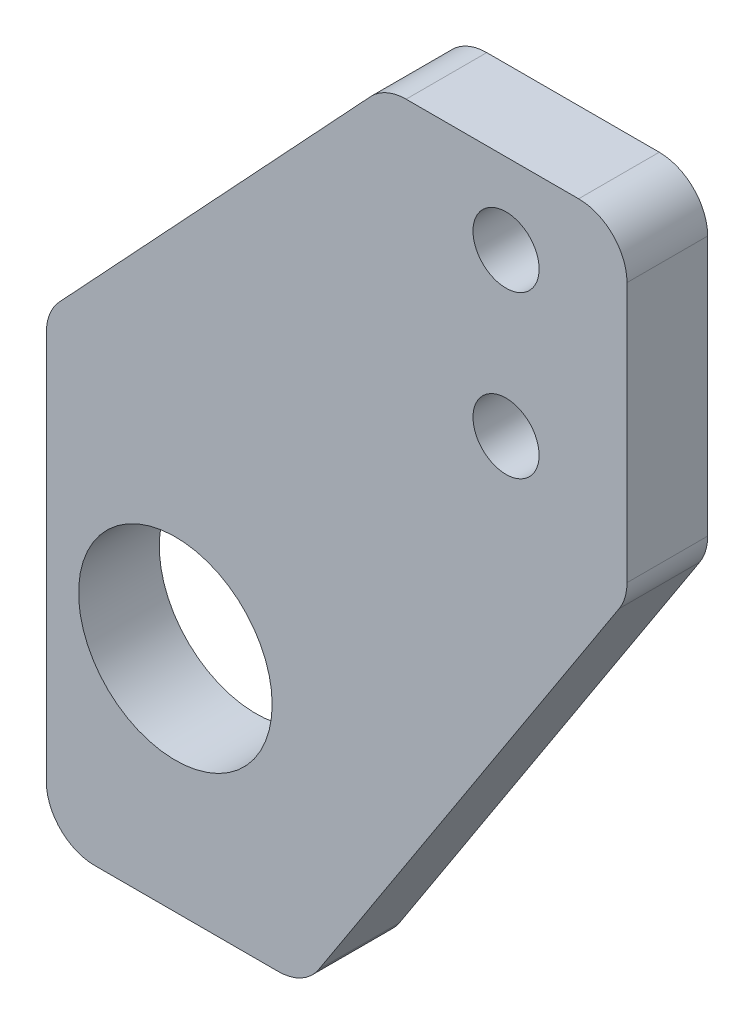
ISO-10303-21;
HEADER;
FILE_DESCRIPTION(('STEP AP214'),'2;1');
FILE_NAME('part.step','',(''),(''),'','','');
FILE_SCHEMA(('AUTOMOTIVE_DESIGN { 1 0 10303 214 1 1 1 1 }'));
ENDSEC;
DATA;
#1=APPLICATION_CONTEXT('core data for automotive mechanical design processes');
#2=APPLICATION_PROTOCOL_DEFINITION('international standard','automotive_design',2000,#1);
#3=PRODUCT_CONTEXT('',#1,'mechanical');
#4=PRODUCT('Part','Part','',(#3));
#5=PRODUCT_RELATED_PRODUCT_CATEGORY('part','',(#4));
#6=PRODUCT_DEFINITION_FORMATION('','',#4);
#7=PRODUCT_DEFINITION_CONTEXT('part definition',#1,'design');
#8=PRODUCT_DEFINITION('design','',#6,#7);
#9=PRODUCT_DEFINITION_SHAPE('','',#8);
#10=(LENGTH_UNIT() NAMED_UNIT(*) SI_UNIT(.MILLI.,.METRE.));
#11=(NAMED_UNIT(*) PLANE_ANGLE_UNIT() SI_UNIT($,.RADIAN.));
#12=(NAMED_UNIT(*) SI_UNIT($,.STERADIAN.) SOLID_ANGLE_UNIT());
#13=UNCERTAINTY_MEASURE_WITH_UNIT(LENGTH_MEASURE(1.E-05),#10,'distance_accuracy_value','');
#14=(GEOMETRIC_REPRESENTATION_CONTEXT(3) GLOBAL_UNCERTAINTY_ASSIGNED_CONTEXT((#13)) GLOBAL_UNIT_ASSIGNED_CONTEXT((#10,
#11,#12)) REPRESENTATION_CONTEXT('',''));
#15=CARTESIAN_POINT('',(0.,0.,0.));
#16=DIRECTION('',(0.,0.,1.));
#17=DIRECTION('',(1.,0.,0.));
#18=AXIS2_PLACEMENT_3D('',#15,#16,#17);
#19=CARTESIAN_POINT('',(-33.3562945368171,31.132541567696,5.));
#20=DIRECTION('',(-0.731055268242869,0.682318250360011,0.));
#21=DIRECTION('',(-0.682318250360011,-0.731055268242869,0.));
#22=AXIS2_PLACEMENT_3D('',#19,#20,#21);
#23=PLANE('',#22);
#24=DIRECTION('',(0.682318250360011,0.731055268242869,0.));
#25=VECTOR('',#24,1.);
#26=CARTESIAN_POINT('',(-33.3562945368171,31.132541567696,0.));
#27=LINE('',#26,#25);
#28=CARTESIAN_POINT('',(-35.1931658047286,29.1644652092193,0.));
#29=VERTEX_POINT('',#28);
#30=CARTESIAN_POINT('',(-15.889508898992,49.84695475108,0.));
#31=VERTEX_POINT('',#30);
#32=EDGE_CURVE('E219',#29,#31,#27,.T.);
#33=ORIENTED_EDGE('',*,*,#32,.F.);
#34=DIRECTION('',(0.,0.,-1.));
#35=VECTOR('',#34,1.);
#36=CARTESIAN_POINT('',(-35.1931658047286,29.1644652092193,5.));
#37=LINE('',#36,#35);
#38=CARTESIAN_POINT('',(-35.1931658047286,29.1644652092193,5.));
#39=VERTEX_POINT('',#38);
#40=EDGE_CURVE('E191',#29,#39,#37,.F.);
#41=ORIENTED_EDGE('',*,*,#40,.T.);
#42=DIRECTION('',(0.682318250360011,0.731055268242869,0.));
#43=VECTOR('',#42,1.);
#44=CARTESIAN_POINT('',(-33.3562945368171,31.132541567696,5.));
#45=LINE('',#44,#43);
#46=CARTESIAN_POINT('',(-15.889508898992,49.84695475108,5.));
#47=VERTEX_POINT('',#46);
#48=EDGE_CURVE('E237',#39,#47,#45,.T.);
#49=ORIENTED_EDGE('',*,*,#48,.T.);
#50=DIRECTION('',(0.,0.,-1.));
#51=VECTOR('',#50,1.);
#52=CARTESIAN_POINT('',(-15.889508898992,49.84695475108,0.));
#53=LINE('',#52,#51);
#54=EDGE_CURVE('E188',#47,#31,#53,.T.);
#55=ORIENTED_EDGE('',*,*,#54,.T.);
#56=EDGE_LOOP('',(#33,#41,#49,#55));
#57=FACE_BOUND('',#56,.T.);
#58=ADVANCED_FACE('F35',(#57),#23,.T.);
#59=CARTESIAN_POINT('',(-36.,0.,5.));
#60=DIRECTION('',(-1.,0.,0.));
#61=DIRECTION('',(0.,0.,1.));
#62=AXIS2_PLACEMENT_3D('',#59,#60,#61);
#63=PLANE('',#62);
#64=DIRECTION('',(0.,1.,0.));
#65=VECTOR('',#64,1.);
#66=CARTESIAN_POINT('',(-36.,0.,0.));
#67=LINE('',#66,#65);
#68=CARTESIAN_POINT('',(-36.,3.,0.));
#69=VERTEX_POINT('',#68);
#70=CARTESIAN_POINT('',(-36.,27.1175104581393,0.));
#71=VERTEX_POINT('',#70);
#72=EDGE_CURVE('E216',#69,#71,#67,.T.);
#73=ORIENTED_EDGE('',*,*,#72,.F.);
#74=DIRECTION('',(0.,0.,-1.));
#75=VECTOR('',#74,1.);
#76=CARTESIAN_POINT('',(-36.,3.,5.));
#77=LINE('',#76,#75);
#78=CARTESIAN_POINT('',(-36.,3.,5.));
#79=VERTEX_POINT('',#78);
#80=EDGE_CURVE('E186',#69,#79,#77,.F.);
#81=ORIENTED_EDGE('',*,*,#80,.T.);
#82=DIRECTION('',(0.,1.,0.));
#83=VECTOR('',#82,1.);
#84=CARTESIAN_POINT('',(-36.,0.,5.));
#85=LINE('',#84,#83);
#86=CARTESIAN_POINT('',(-36.,27.1175104581393,5.));
#87=VERTEX_POINT('',#86);
#88=EDGE_CURVE('E234',#79,#87,#85,.T.);
#89=ORIENTED_EDGE('',*,*,#88,.T.);
#90=DIRECTION('',(0.,0.,-1.));
#91=VECTOR('',#90,1.);
#92=CARTESIAN_POINT('',(-36.,27.1175104581393,5.));
#93=LINE('',#92,#91);
#94=EDGE_CURVE('E183',#87,#71,#93,.T.);
#95=ORIENTED_EDGE('',*,*,#94,.T.);
#96=EDGE_LOOP('',(#73,#81,#89,#95));
#97=FACE_BOUND('',#96,.T.);
#98=ADVANCED_FACE('F274',(#97),#63,.T.);
#99=CARTESIAN_POINT('',(0.,0.,5.));
#100=DIRECTION('',(0.,-1.,0.));
#101=DIRECTION('',(1.,0.,0.));
#102=AXIS2_PLACEMENT_3D('',#99,#100,#101);
#103=PLANE('',#102);
#104=DIRECTION('',(-1.,0.,0.));
#105=VECTOR('',#104,1.);
#106=CARTESIAN_POINT('',(0.,0.,0.));
#107=LINE('',#106,#105);
#108=CARTESIAN_POINT('',(-21.6289448917997,0.,0.));
#109=VERTEX_POINT('',#108);
#110=CARTESIAN_POINT('',(-33.,0.,0.));
#111=VERTEX_POINT('',#110);
#112=EDGE_CURVE('E146',#109,#111,#107,.T.);
#113=ORIENTED_EDGE('',*,*,#112,.F.);
#114=DIRECTION('',(0.,0.,-1.));
#115=VECTOR('',#114,1.);
#116=CARTESIAN_POINT('',(-21.6289448917997,0.,5.));
#117=LINE('',#116,#115);
#118=CARTESIAN_POINT('',(-21.6289448917997,0.,5.));
#119=VERTEX_POINT('',#118);
#120=EDGE_CURVE('E171',#109,#119,#117,.F.);
#121=ORIENTED_EDGE('',*,*,#120,.T.);
#122=DIRECTION('',(-1.,0.,0.));
#123=VECTOR('',#122,1.);
#124=CARTESIAN_POINT('',(0.,0.,5.));
#125=LINE('',#124,#123);
#126=CARTESIAN_POINT('',(-33.,0.,5.));
#127=VERTEX_POINT('',#126);
#128=EDGE_CURVE('E231',#119,#127,#125,.T.);
#129=ORIENTED_EDGE('',*,*,#128,.T.);
#130=DIRECTION('',(0.,0.,-1.));
#131=VECTOR('',#130,1.);
#132=CARTESIAN_POINT('',(-33.,0.,5.));
#133=LINE('',#132,#131);
#134=EDGE_CURVE('E168',#127,#111,#133,.T.);
#135=ORIENTED_EDGE('',*,*,#134,.T.);
#136=EDGE_LOOP('',(#113,#121,#129,#135));
#137=FACE_BOUND('',#136,.T.);
#138=ADVANCED_FACE('F280',(#137),#103,.T.);
#139=CARTESIAN_POINT('',(-14.0680982322933,9.13512872226836,5.));
#140=DIRECTION('',(0.838692381993937,-0.544605442853206,0.));
#141=DIRECTION('',(0.544605442853206,0.838692381993937,0.));
#142=AXIS2_PLACEMENT_3D('',#139,#140,#141);
#143=PLANE('',#142);
#144=DIRECTION('',(-0.544605442853206,-0.838692381993937,0.));
#145=VECTOR('',#144,1.);
#146=CARTESIAN_POINT('',(-14.0680982322933,9.13512872226836,5.));
#147=LINE('',#146,#145);
#148=CARTESIAN_POINT('',(-0.483922854018187,30.054758804812,5.));
#149=VERTEX_POINT('',#148);
#150=CARTESIAN_POINT('',(-19.1128677458179,1.36618367144038,5.));
#151=VERTEX_POINT('',#150);
#152=EDGE_CURVE('E203',#149,#151,#147,.T.);
#153=ORIENTED_EDGE('',*,*,#152,.T.);
#154=DIRECTION('',(0.,0.,-1.));
#155=VECTOR('',#154,1.);
#156=CARTESIAN_POINT('',(-19.1128677458179,1.36618367144038,5.));
#157=LINE('',#156,#155);
#158=CARTESIAN_POINT('',(-19.1128677458179,1.36618367144038,0.));
#159=VERTEX_POINT('',#158);
#160=EDGE_CURVE('E145',#151,#159,#157,.T.);
#161=ORIENTED_EDGE('',*,*,#160,.T.);
#162=DIRECTION('',(-0.544605442853206,-0.838692381993937,0.));
#163=VECTOR('',#162,1.);
#164=CARTESIAN_POINT('',(-14.0680982322933,9.13512872226836,0.));
#165=LINE('',#164,#163);
#166=CARTESIAN_POINT('',(-0.483922854018187,30.054758804812,0.));
#167=VERTEX_POINT('',#166);
#168=EDGE_CURVE('E129',#167,#159,#165,.T.);
#169=ORIENTED_EDGE('',*,*,#168,.F.);
#170=DIRECTION('',(0.,0.,-1.));
#171=VECTOR('',#170,1.);
#172=CARTESIAN_POINT('',(-0.483922854018189,30.054758804812,5.));
#173=LINE('',#172,#171);
#174=EDGE_CURVE('E142',#167,#149,#173,.F.);
#175=ORIENTED_EDGE('',*,*,#174,.T.);
#176=EDGE_LOOP('',(#153,#161,#169,#175));
#177=FACE_BOUND('',#176,.T.);
#178=ADVANCED_FACE('F141',(#177),#143,.T.);
#179=CARTESIAN_POINT('',(0.,0.,5.));
#180=DIRECTION('',(-1.,0.,0.));
#181=DIRECTION('',(0.,0.,1.));
#182=AXIS2_PLACEMENT_3D('',#179,#180,#181);
#183=PLANE('',#182);
#184=DIRECTION('',(0.,1.,0.));
#185=VECTOR('',#184,1.);
#186=CARTESIAN_POINT('',(0.,0.,5.));
#187=LINE('',#186,#185);
#188=CARTESIAN_POINT('',(0.,31.6885751333716,5.));
#189=VERTEX_POINT('',#188);
#190=CARTESIAN_POINT('',(0.,47.8,5.));
#191=VERTEX_POINT('',#190);
#192=EDGE_CURVE('E154',#189,#191,#187,.T.);
#193=ORIENTED_EDGE('',*,*,#192,.F.);
#194=DIRECTION('',(0.,0.,-1.));
#195=VECTOR('',#194,1.);
#196=CARTESIAN_POINT('',(0.,31.6885751333716,0.));
#197=LINE('',#196,#195);
#198=CARTESIAN_POINT('',(0.,31.6885751333716,0.));
#199=VERTEX_POINT('',#198);
#200=EDGE_CURVE('E11',#189,#199,#197,.T.);
#201=ORIENTED_EDGE('',*,*,#200,.T.);
#202=DIRECTION('',(0.,1.,0.));
#203=VECTOR('',#202,1.);
#204=CARTESIAN_POINT('',(0.,0.,0.));
#205=LINE('',#204,#203);
#206=CARTESIAN_POINT('',(0.,47.8,0.));
#207=VERTEX_POINT('',#206);
#208=EDGE_CURVE('E131',#199,#207,#205,.T.);
#209=ORIENTED_EDGE('',*,*,#208,.T.);
#210=DIRECTION('',(0.,0.,-1.));
#211=VECTOR('',#210,1.);
#212=CARTESIAN_POINT('',(0.,47.8,5.));
#213=LINE('',#212,#211);
#214=EDGE_CURVE('E43',#207,#191,#213,.F.);
#215=ORIENTED_EDGE('',*,*,#214,.T.);
#216=EDGE_LOOP('',(#193,#201,#209,#215));
#217=FACE_BOUND('',#216,.T.);
#218=ADVANCED_FACE('F199',(#217),#183,.F.);
#219=CARTESIAN_POINT('',(-7.49999999999998,45.8,5.));
#220=DIRECTION('',(0.,0.,-1.));
#221=DIRECTION('',(-1.,0.,0.));
#222=AXIS2_PLACEMENT_3D('',#219,#220,#221);
#223=CYLINDRICAL_SURFACE('',#222,2.05000000000001);
#224=CARTESIAN_POINT('',(-7.49999999999998,45.8,5.));
#225=DIRECTION('',(0.,0.,1.));
#226=DIRECTION('',(1.,0.,0.));
#227=AXIS2_PLACEMENT_3D('',#224,#225,#226);
#228=CIRCLE('',#227,2.05000000000001);
#229=CARTESIAN_POINT('',(-5.44999999999998,45.8,5.));
#230=VERTEX_POINT('',#229);
#231=EDGE_CURVE('E240',#230,#230,#228,.T.);
#232=ORIENTED_EDGE('',*,*,#231,.T.);
#233=EDGE_LOOP('',(#232));
#234=FACE_BOUND('',#233,.T.);
#235=CARTESIAN_POINT('',(-7.49999999999998,45.8,0.));
#236=DIRECTION('',(0.,0.,1.));
#237=DIRECTION('',(1.,0.,0.));
#238=AXIS2_PLACEMENT_3D('',#235,#236,#237);
#239=CIRCLE('',#238,2.05000000000001);
#240=CARTESIAN_POINT('',(-5.44999999999998,45.8,0.));
#241=VERTEX_POINT('',#240);
#242=EDGE_CURVE('E221',#241,#241,#239,.T.);
#243=ORIENTED_EDGE('',*,*,#242,.F.);
#244=EDGE_LOOP('',(#243));
#245=FACE_BOUND('',#244,.T.);
#246=ADVANCED_FACE('F255',(#234,#245),#223,.F.);
#247=CARTESIAN_POINT('',(-7.49999999999998,35.8,5.));
#248=DIRECTION('',(0.,0.,-1.));
#249=DIRECTION('',(-1.,0.,0.));
#250=AXIS2_PLACEMENT_3D('',#247,#248,#249);
#251=CYLINDRICAL_SURFACE('',#250,2.05000000000001);
#252=CARTESIAN_POINT('',(-7.49999999999998,35.8,5.));
#253=DIRECTION('',(0.,0.,1.));
#254=DIRECTION('',(1.,0.,0.));
#255=AXIS2_PLACEMENT_3D('',#252,#253,#254);
#256=CIRCLE('',#255,2.05000000000001);
#257=CARTESIAN_POINT('',(-5.44999999999998,35.8,5.));
#258=VERTEX_POINT('',#257);
#259=EDGE_CURVE('E211',#258,#258,#256,.T.);
#260=ORIENTED_EDGE('',*,*,#259,.T.);
#261=EDGE_LOOP('',(#260));
#262=FACE_BOUND('',#261,.T.);
#263=CARTESIAN_POINT('',(-7.49999999999998,35.8,0.));
#264=DIRECTION('',(0.,0.,1.));
#265=DIRECTION('',(1.,0.,0.));
#266=AXIS2_PLACEMENT_3D('',#263,#264,#265);
#267=CIRCLE('',#266,2.05000000000001);
#268=CARTESIAN_POINT('',(-5.44999999999998,35.8,0.));
#269=VERTEX_POINT('',#268);
#270=EDGE_CURVE('E224',#269,#269,#267,.T.);
#271=ORIENTED_EDGE('',*,*,#270,.F.);
#272=EDGE_LOOP('',(#271));
#273=FACE_BOUND('',#272,.T.);
#274=ADVANCED_FACE('F246',(#262,#273),#251,.F.);
#275=CARTESIAN_POINT('',(-28.,14.15,5.));
#276=DIRECTION('',(0.,0.,-1.));
#277=DIRECTION('',(-1.,0.,0.));
#278=AXIS2_PLACEMENT_3D('',#275,#276,#277);
#279=CYLINDRICAL_SURFACE('',#278,6.);
#280=CARTESIAN_POINT('',(-28.,14.15,5.));
#281=DIRECTION('',(0.,0.,1.));
#282=DIRECTION('',(1.,0.,0.));
#283=AXIS2_PLACEMENT_3D('',#280,#281,#282);
#284=CIRCLE('',#283,6.);
#285=CARTESIAN_POINT('',(-22.,14.15,5.));
#286=VERTEX_POINT('',#285);
#287=EDGE_CURVE('E209',#286,#286,#284,.T.);
#288=ORIENTED_EDGE('',*,*,#287,.T.);
#289=EDGE_LOOP('',(#288));
#290=FACE_BOUND('',#289,.T.);
#291=CARTESIAN_POINT('',(-28.,14.15,0.));
#292=DIRECTION('',(0.,0.,1.));
#293=DIRECTION('',(1.,0.,0.));
#294=AXIS2_PLACEMENT_3D('',#291,#292,#293);
#295=CIRCLE('',#294,6.);
#296=CARTESIAN_POINT('',(-22.,14.15,0.));
#297=VERTEX_POINT('',#296);
#298=EDGE_CURVE('E227',#297,#297,#295,.T.);
#299=ORIENTED_EDGE('',*,*,#298,.F.);
#300=EDGE_LOOP('',(#299));
#301=FACE_BOUND('',#300,.T.);
#302=ADVANCED_FACE('F288',(#290,#301),#279,.F.);
#303=CARTESIAN_POINT('',(0.,50.8,5.));
#304=DIRECTION('',(0.,-1.,0.));
#305=DIRECTION('',(1.,0.,0.));
#306=AXIS2_PLACEMENT_3D('',#303,#304,#305);
#307=PLANE('',#306);
#308=DIRECTION('',(-1.,0.,0.));
#309=VECTOR('',#308,1.);
#310=CARTESIAN_POINT('',(0.,50.8,0.));
#311=LINE('',#310,#309);
#312=CARTESIAN_POINT('',(-3.,50.8,0.));
#313=VERTEX_POINT('',#312);
#314=CARTESIAN_POINT('',(-13.6963430942634,50.8,0.));
#315=VERTEX_POINT('',#314);
#316=EDGE_CURVE('E157',#313,#315,#311,.T.);
#317=ORIENTED_EDGE('',*,*,#316,.T.);
#318=DIRECTION('',(0.,0.,-1.));
#319=VECTOR('',#318,1.);
#320=CARTESIAN_POINT('',(-13.6963430942634,50.8,5.));
#321=LINE('',#320,#319);
#322=CARTESIAN_POINT('',(-13.6963430942634,50.8,5.));
#323=VERTEX_POINT('',#322);
#324=EDGE_CURVE('E50',#315,#323,#321,.F.);
#325=ORIENTED_EDGE('',*,*,#324,.T.);
#326=DIRECTION('',(-1.,0.,0.));
#327=VECTOR('',#326,1.);
#328=CARTESIAN_POINT('',(0.,50.8,5.));
#329=LINE('',#328,#327);
#330=CARTESIAN_POINT('',(-3.,50.8,5.));
#331=VERTEX_POINT('',#330);
#332=EDGE_CURVE('E151',#331,#323,#329,.T.);
#333=ORIENTED_EDGE('',*,*,#332,.F.);
#334=DIRECTION('',(0.,0.,-1.));
#335=VECTOR('',#334,1.);
#336=CARTESIAN_POINT('',(-3.,50.8,5.));
#337=LINE('',#336,#335);
#338=EDGE_CURVE('E193',#331,#313,#337,.T.);
#339=ORIENTED_EDGE('',*,*,#338,.T.);
#340=EDGE_LOOP('',(#317,#325,#333,#339));
#341=FACE_BOUND('',#340,.T.);
#342=ADVANCED_FACE('F207',(#341),#307,.F.);
#343=CARTESIAN_POINT('',(0.,0.,5.));
#344=DIRECTION('',(0.,0.,1.));
#345=DIRECTION('',(1.,0.,0.));
#346=AXIS2_PLACEMENT_3D('',#343,#344,#345);
#347=PLANE('',#346);
#348=ORIENTED_EDGE('',*,*,#287,.F.);
#349=EDGE_LOOP('',(#348));
#350=FACE_BOUND('',#349,.T.);
#351=ORIENTED_EDGE('',*,*,#259,.F.);
#352=EDGE_LOOP('',(#351));
#353=FACE_BOUND('',#352,.T.);
#354=ORIENTED_EDGE('',*,*,#231,.F.);
#355=EDGE_LOOP('',(#354));
#356=FACE_BOUND('',#355,.T.);
#357=ORIENTED_EDGE('',*,*,#128,.F.);
#358=CARTESIAN_POINT('',(-21.6289448917997,3.,5.));
#359=DIRECTION('',(0.,0.,1.));
#360=DIRECTION('',(1.,0.,0.));
#361=AXIS2_PLACEMENT_3D('',#358,#359,#360);
#362=CIRCLE('',#361,3.);
#363=EDGE_CURVE('E181',#119,#151,#362,.T.);
#364=ORIENTED_EDGE('',*,*,#363,.T.);
#365=ORIENTED_EDGE('',*,*,#152,.F.);
#366=CARTESIAN_POINT('',(-3.,31.6885751333716,5.));
#367=DIRECTION('',(0.,0.,1.));
#368=DIRECTION('',(1.,0.,0.));
#369=AXIS2_PLACEMENT_3D('',#366,#367,#368);
#370=CIRCLE('',#369,3.);
#371=EDGE_CURVE('E150',#149,#189,#370,.T.);
#372=ORIENTED_EDGE('',*,*,#371,.T.);
#373=ORIENTED_EDGE('',*,*,#192,.T.);
#374=CARTESIAN_POINT('',(-3.,47.8,5.));
#375=DIRECTION('',(0.,0.,1.));
#376=DIRECTION('',(1.,0.,0.));
#377=AXIS2_PLACEMENT_3D('',#374,#375,#376);
#378=CIRCLE('',#377,3.);
#379=EDGE_CURVE('E57',#191,#331,#378,.T.);
#380=ORIENTED_EDGE('',*,*,#379,.T.);
#381=ORIENTED_EDGE('',*,*,#332,.T.);
#382=CARTESIAN_POINT('',(-13.6963430942634,47.8,5.));
#383=DIRECTION('',(0.,0.,1.));
#384=DIRECTION('',(1.,0.,0.));
#385=AXIS2_PLACEMENT_3D('',#382,#383,#384);
#386=CIRCLE('',#385,3.);
#387=EDGE_CURVE('E175',#323,#47,#386,.T.);
#388=ORIENTED_EDGE('',*,*,#387,.T.);
#389=ORIENTED_EDGE('',*,*,#48,.F.);
#390=CARTESIAN_POINT('',(-33.,27.1175104581393,5.));
#391=DIRECTION('',(0.,0.,1.));
#392=DIRECTION('',(1.,0.,0.));
#393=AXIS2_PLACEMENT_3D('',#390,#391,#392);
#394=CIRCLE('',#393,3.);
#395=EDGE_CURVE('E177',#39,#87,#394,.T.);
#396=ORIENTED_EDGE('',*,*,#395,.T.);
#397=ORIENTED_EDGE('',*,*,#88,.F.);
#398=CARTESIAN_POINT('',(-33.,3.,5.));
#399=DIRECTION('',(0.,0.,1.));
#400=DIRECTION('',(1.,0.,0.));
#401=AXIS2_PLACEMENT_3D('',#398,#399,#400);
#402=CIRCLE('',#401,3.);
#403=EDGE_CURVE('E179',#79,#127,#402,.T.);
#404=ORIENTED_EDGE('',*,*,#403,.T.);
#405=EDGE_LOOP('',(#357,#364,#365,#372,#373,#380,#381,#388,#389,#396,#397,#404));
#406=FACE_BOUND('',#405,.T.);
#407=ADVANCED_FACE('F202',(#350,#353,#356,#406),#347,.T.);
#408=CARTESIAN_POINT('',(0.,0.,0.));
#409=DIRECTION('',(0.,0.,1.));
#410=DIRECTION('',(1.,0.,0.));
#411=AXIS2_PLACEMENT_3D('',#408,#409,#410);
#412=PLANE('',#411);
#413=ORIENTED_EDGE('',*,*,#298,.T.);
#414=EDGE_LOOP('',(#413));
#415=FACE_BOUND('',#414,.T.);
#416=ORIENTED_EDGE('',*,*,#270,.T.);
#417=EDGE_LOOP('',(#416));
#418=FACE_BOUND('',#417,.T.);
#419=ORIENTED_EDGE('',*,*,#242,.T.);
#420=EDGE_LOOP('',(#419));
#421=FACE_BOUND('',#420,.T.);
#422=ORIENTED_EDGE('',*,*,#168,.T.);
#423=CARTESIAN_POINT('',(-21.6289448917997,3.,0.));
#424=DIRECTION('',(0.,0.,1.));
#425=DIRECTION('',(1.,0.,0.));
#426=AXIS2_PLACEMENT_3D('',#423,#424,#425);
#427=CIRCLE('',#426,3.);
#428=EDGE_CURVE('E166',#159,#109,#427,.F.);
#429=ORIENTED_EDGE('',*,*,#428,.T.);
#430=ORIENTED_EDGE('',*,*,#112,.T.);
#431=CARTESIAN_POINT('',(-33.,3.,0.));
#432=DIRECTION('',(0.,0.,1.));
#433=DIRECTION('',(1.,0.,0.));
#434=AXIS2_PLACEMENT_3D('',#431,#432,#433);
#435=CIRCLE('',#434,3.);
#436=EDGE_CURVE('E164',#111,#69,#435,.F.);
#437=ORIENTED_EDGE('',*,*,#436,.T.);
#438=ORIENTED_EDGE('',*,*,#72,.T.);
#439=CARTESIAN_POINT('',(-33.,27.1175104581393,0.));
#440=DIRECTION('',(0.,0.,1.));
#441=DIRECTION('',(1.,0.,0.));
#442=AXIS2_PLACEMENT_3D('',#439,#440,#441);
#443=CIRCLE('',#442,3.);
#444=EDGE_CURVE('E162',#71,#29,#443,.F.);
#445=ORIENTED_EDGE('',*,*,#444,.T.);
#446=ORIENTED_EDGE('',*,*,#32,.T.);
#447=CARTESIAN_POINT('',(-13.6963430942634,47.8,0.));
#448=DIRECTION('',(0.,0.,1.));
#449=DIRECTION('',(1.,0.,0.));
#450=AXIS2_PLACEMENT_3D('',#447,#448,#449);
#451=CIRCLE('',#450,3.);
#452=EDGE_CURVE('E135',#31,#315,#451,.F.);
#453=ORIENTED_EDGE('',*,*,#452,.T.);
#454=ORIENTED_EDGE('',*,*,#316,.F.);
#455=CARTESIAN_POINT('',(-3.,47.8,0.));
#456=DIRECTION('',(0.,0.,1.));
#457=DIRECTION('',(1.,0.,0.));
#458=AXIS2_PLACEMENT_3D('',#455,#456,#457);
#459=CIRCLE('',#458,3.);
#460=EDGE_CURVE('E136',#313,#207,#459,.F.);
#461=ORIENTED_EDGE('',*,*,#460,.T.);
#462=ORIENTED_EDGE('',*,*,#208,.F.);
#463=CARTESIAN_POINT('',(-3.,31.6885751333716,0.));
#464=DIRECTION('',(0.,0.,1.));
#465=DIRECTION('',(1.,0.,0.));
#466=AXIS2_PLACEMENT_3D('',#463,#464,#465);
#467=CIRCLE('',#466,3.);
#468=EDGE_CURVE('E126',#199,#167,#467,.F.);
#469=ORIENTED_EDGE('',*,*,#468,.T.);
#470=EDGE_LOOP('',(#422,#429,#430,#437,#438,#445,#446,#453,#454,#461,#462,#469));
#471=FACE_BOUND('',#470,.T.);
#472=ADVANCED_FACE('F128',(#415,#418,#421,#471),#412,.F.);
#473=CARTESIAN_POINT('',(-21.6289448917997,3.,5.));
#474=DIRECTION('',(0.,0.,-1.));
#475=DIRECTION('',(-1.,0.,0.));
#476=AXIS2_PLACEMENT_3D('',#473,#474,#475);
#477=CYLINDRICAL_SURFACE('',#476,3.);
#478=ORIENTED_EDGE('',*,*,#363,.F.);
#479=ORIENTED_EDGE('',*,*,#120,.F.);
#480=ORIENTED_EDGE('',*,*,#428,.F.);
#481=ORIENTED_EDGE('',*,*,#160,.F.);
#482=EDGE_LOOP('',(#478,#479,#480,#481));
#483=FACE_BOUND('',#482,.T.);
#484=ADVANCED_FACE('F262',(#483),#477,.T.);
#485=CARTESIAN_POINT('',(-33.,3.,5.));
#486=DIRECTION('',(0.,0.,-1.));
#487=DIRECTION('',(-1.,0.,0.));
#488=AXIS2_PLACEMENT_3D('',#485,#486,#487);
#489=CYLINDRICAL_SURFACE('',#488,3.);
#490=ORIENTED_EDGE('',*,*,#403,.F.);
#491=ORIENTED_EDGE('',*,*,#80,.F.);
#492=ORIENTED_EDGE('',*,*,#436,.F.);
#493=ORIENTED_EDGE('',*,*,#134,.F.);
#494=EDGE_LOOP('',(#490,#491,#492,#493));
#495=FACE_BOUND('',#494,.T.);
#496=ADVANCED_FACE('F268',(#495),#489,.T.);
#497=CARTESIAN_POINT('',(-33.,27.1175104581393,5.));
#498=DIRECTION('',(0.,0.,-1.));
#499=DIRECTION('',(-1.,0.,0.));
#500=AXIS2_PLACEMENT_3D('',#497,#498,#499);
#501=CYLINDRICAL_SURFACE('',#500,3.);
#502=ORIENTED_EDGE('',*,*,#395,.F.);
#503=ORIENTED_EDGE('',*,*,#40,.F.);
#504=ORIENTED_EDGE('',*,*,#444,.F.);
#505=ORIENTED_EDGE('',*,*,#94,.F.);
#506=EDGE_LOOP('',(#502,#503,#504,#505));
#507=FACE_BOUND('',#506,.T.);
#508=ADVANCED_FACE('F294',(#507),#501,.T.);
#509=CARTESIAN_POINT('',(-13.6963430942634,47.8,5.));
#510=DIRECTION('',(0.,0.,1.));
#511=DIRECTION('',(1.,0.,0.));
#512=AXIS2_PLACEMENT_3D('',#509,#510,#511);
#513=CYLINDRICAL_SURFACE('',#512,3.);
#514=ORIENTED_EDGE('',*,*,#387,.F.);
#515=ORIENTED_EDGE('',*,*,#324,.F.);
#516=ORIENTED_EDGE('',*,*,#452,.F.);
#517=ORIENTED_EDGE('',*,*,#54,.F.);
#518=EDGE_LOOP('',(#514,#515,#516,#517));
#519=FACE_BOUND('',#518,.T.);
#520=ADVANCED_FACE('F298',(#519),#513,.T.);
#521=CARTESIAN_POINT('',(-3.,31.6885751333716,5.));
#522=DIRECTION('',(0.,0.,1.));
#523=DIRECTION('',(1.,0.,0.));
#524=AXIS2_PLACEMENT_3D('',#521,#522,#523);
#525=CYLINDRICAL_SURFACE('',#524,3.);
#526=ORIENTED_EDGE('',*,*,#371,.F.);
#527=ORIENTED_EDGE('',*,*,#174,.F.);
#528=ORIENTED_EDGE('',*,*,#468,.F.);
#529=ORIENTED_EDGE('',*,*,#200,.F.);
#530=EDGE_LOOP('',(#526,#527,#528,#529));
#531=FACE_BOUND('',#530,.T.);
#532=ADVANCED_FACE('F149',(#531),#525,.T.);
#533=CARTESIAN_POINT('',(-3.,47.8,5.));
#534=DIRECTION('',(0.,0.,-1.));
#535=DIRECTION('',(-1.,0.,0.));
#536=AXIS2_PLACEMENT_3D('',#533,#534,#535);
#537=CYLINDRICAL_SURFACE('',#536,3.);
#538=ORIENTED_EDGE('',*,*,#379,.F.);
#539=ORIENTED_EDGE('',*,*,#214,.F.);
#540=ORIENTED_EDGE('',*,*,#460,.F.);
#541=ORIENTED_EDGE('',*,*,#338,.F.);
#542=EDGE_LOOP('',(#538,#539,#540,#541));
#543=FACE_BOUND('',#542,.T.);
#544=ADVANCED_FACE('F37',(#543),#537,.T.);
#545=CLOSED_SHELL('',(#58,#98,#138,#178,#218,#246,#274,#302,#342,#407,#472,#484,#496,#508,#520,
#532,#544));
#546=MANIFOLD_SOLID_BREP('B2',#545);
#547=ADVANCED_BREP_SHAPE_REPRESENTATION('',(#18,#546),#14);
#548=SHAPE_DEFINITION_REPRESENTATION(#9,#547);
ENDSEC;
END-ISO-10303-21;
